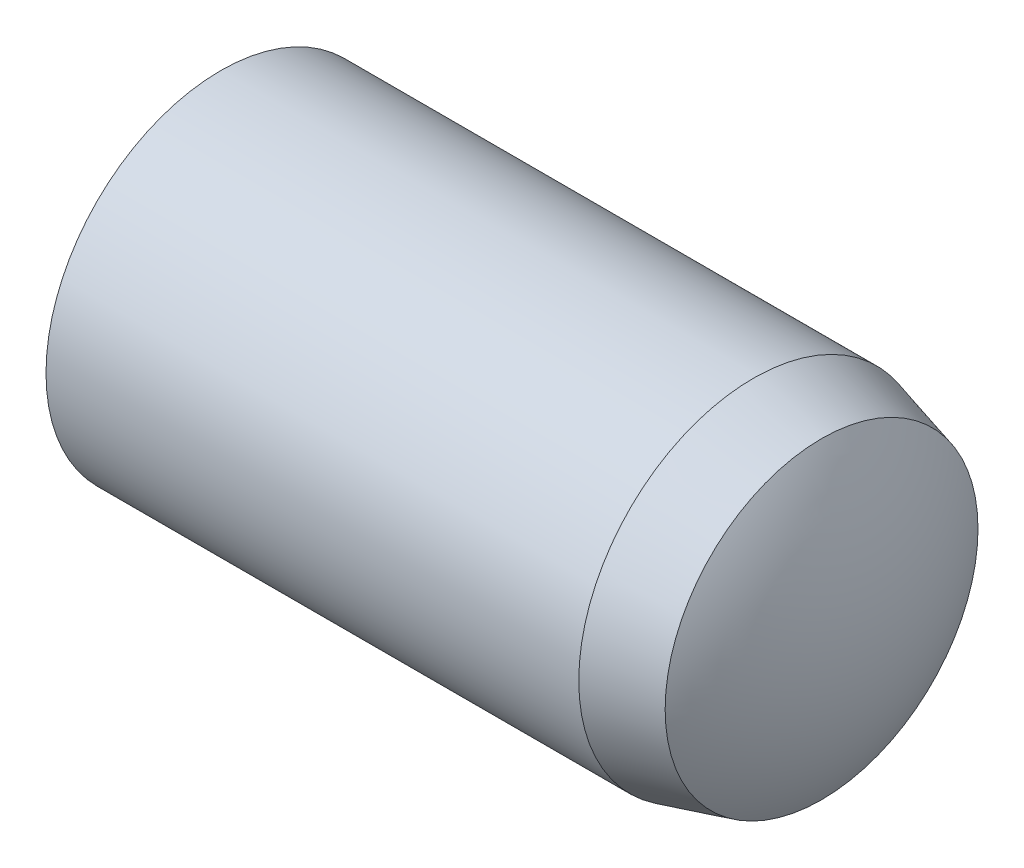
ISO-10303-21;
HEADER;
FILE_DESCRIPTION(('STEP AP214'),'2;1');
FILE_NAME('part.step','',(''),(''),'','','');
FILE_SCHEMA(('AUTOMOTIVE_DESIGN { 1 0 10303 214 1 1 1 1 }'));
ENDSEC;
DATA;
#1=APPLICATION_CONTEXT('core data for automotive mechanical design processes');
#2=APPLICATION_PROTOCOL_DEFINITION('international standard','automotive_design',2000,#1);
#3=PRODUCT_CONTEXT('',#1,'mechanical');
#4=PRODUCT('Part','Part','',(#3));
#5=PRODUCT_RELATED_PRODUCT_CATEGORY('part','',(#4));
#6=PRODUCT_DEFINITION_FORMATION('','',#4);
#7=PRODUCT_DEFINITION_CONTEXT('part definition',#1,'design');
#8=PRODUCT_DEFINITION('design','',#6,#7);
#9=PRODUCT_DEFINITION_SHAPE('','',#8);
#10=(LENGTH_UNIT() NAMED_UNIT(*) SI_UNIT(.MILLI.,.METRE.));
#11=(NAMED_UNIT(*) PLANE_ANGLE_UNIT() SI_UNIT($,.RADIAN.));
#12=(NAMED_UNIT(*) SI_UNIT($,.STERADIAN.) SOLID_ANGLE_UNIT());
#13=UNCERTAINTY_MEASURE_WITH_UNIT(LENGTH_MEASURE(1.E-05),#10,'distance_accuracy_value','');
#14=(GEOMETRIC_REPRESENTATION_CONTEXT(3) GLOBAL_UNCERTAINTY_ASSIGNED_CONTEXT((#13)) GLOBAL_UNIT_ASSIGNED_CONTEXT((#10,
#11,#12)) REPRESENTATION_CONTEXT('',''));
#15=CARTESIAN_POINT('',(0.,0.,0.));
#16=DIRECTION('',(0.,0.,1.));
#17=DIRECTION('',(1.,0.,0.));
#18=AXIS2_PLACEMENT_3D('',#15,#16,#17);
#19=CARTESIAN_POINT('',(-8.,0.,0.));
#20=DIRECTION('',(1.,0.,0.));
#21=DIRECTION('',(0.,0.,-1.));
#22=AXIS2_PLACEMENT_3D('',#19,#20,#21);
#23=CYLINDRICAL_SURFACE('',#22,4.);
#24=CARTESIAN_POINT('',(5.4,0.,0.));
#25=DIRECTION('',(-1.,0.,0.));
#26=DIRECTION('',(0.,0.,1.));
#27=AXIS2_PLACEMENT_3D('',#24,#25,#26);
#28=CIRCLE('',#27,3.99999999999999);
#29=CARTESIAN_POINT('',(5.4,0.,3.99999999999999));
#30=VERTEX_POINT('',#29);
#31=EDGE_CURVE('E11',#30,#30,#28,.T.);
#32=ORIENTED_EDGE('',*,*,#31,.T.);
#33=EDGE_LOOP('',(#32));
#34=FACE_BOUND('',#33,.T.);
#35=CARTESIAN_POINT('',(-6.8,0.,0.));
#36=DIRECTION('',(-1.,0.,0.));
#37=DIRECTION('',(0.,0.,1.));
#38=AXIS2_PLACEMENT_3D('',#35,#36,#37);
#39=CIRCLE('',#38,4.);
#40=CARTESIAN_POINT('',(-6.8,0.,4.));
#41=VERTEX_POINT('',#40);
#42=EDGE_CURVE('E52',#41,#41,#39,.T.);
#43=ORIENTED_EDGE('',*,*,#42,.F.);
#44=EDGE_LOOP('',(#43));
#45=FACE_BOUND('',#44,.T.);
#46=ADVANCED_FACE('F32',(#34,#45),#23,.T.);
#47=CARTESIAN_POINT('',(5.4,0.,0.));
#48=DIRECTION('',(-1.,0.,0.));
#49=DIRECTION('',(0.,0.,1.));
#50=AXIS2_PLACEMENT_3D('',#47,#48,#49);
#51=CONICAL_SURFACE('',#50,3.99999999999999,0.261799387799149);
#52=CARTESIAN_POINT('',(6.96,0.,0.));
#53=DIRECTION('',(-1.,0.,0.));
#54=DIRECTION('',(0.,0.,1.));
#55=AXIS2_PLACEMENT_3D('',#52,#53,#54);
#56=CIRCLE('',#55,3.58199925980744);
#57=CARTESIAN_POINT('',(6.96,0.,3.58199925980744));
#58=VERTEX_POINT('',#57);
#59=EDGE_CURVE('E39',#58,#58,#56,.T.);
#60=ORIENTED_EDGE('',*,*,#59,.T.);
#61=EDGE_LOOP('',(#60));
#62=FACE_BOUND('',#61,.T.);
#63=ORIENTED_EDGE('',*,*,#31,.F.);
#64=EDGE_LOOP('',(#63));
#65=FACE_BOUND('',#64,.T.);
#66=ADVANCED_FACE('F58',(#62,#65),#51,.T.);
#67=CARTESIAN_POINT('',(1.31138524170139,0.,0.));
#68=DIRECTION('',(-1.,0.,0.));
#69=DIRECTION('',(0.,1.,0.));
#70=AXIS2_PLACEMENT_3D('',#67,#68,#69);
#71=SPHERICAL_SURFACE('',#70,6.68861475829861);
#72=CARTESIAN_POINT('',(8.,0.,0.));
#73=VERTEX_POINT('',#72);
#74=VERTEX_LOOP('',#73);
#75=FACE_BOUND('',#74,.T.);
#76=ORIENTED_EDGE('',*,*,#59,.F.);
#77=EDGE_LOOP('',(#76));
#78=FACE_BOUND('',#77,.T.);
#79=ADVANCED_FACE('F48',(#75,#78),#71,.T.);
#80=CARTESIAN_POINT('',(-0.733333333333329,0.,0.));
#81=DIRECTION('',(-1.,0.,0.));
#82=DIRECTION('',(0.,1.,0.));
#83=AXIS2_PLACEMENT_3D('',#80,#81,#82);
#84=SPHERICAL_SURFACE('',#83,7.26666666666667);
#85=CARTESIAN_POINT('',(-8.,0.,0.));
#86=VERTEX_POINT('',#85);
#87=VERTEX_LOOP('',#86);
#88=FACE_BOUND('',#87,.T.);
#89=ORIENTED_EDGE('',*,*,#42,.T.);
#90=EDGE_LOOP('',(#89));
#91=FACE_BOUND('',#90,.T.);
#92=ADVANCED_FACE('F45',(#88,#91),#84,.T.);
#93=CLOSED_SHELL('',(#46,#66,#79,#92));
#94=MANIFOLD_SOLID_BREP('B2',#93);
#95=ADVANCED_BREP_SHAPE_REPRESENTATION('',(#18,#94),#14);
#96=SHAPE_DEFINITION_REPRESENTATION(#9,#95);
ENDSEC;
END-ISO-10303-21;
